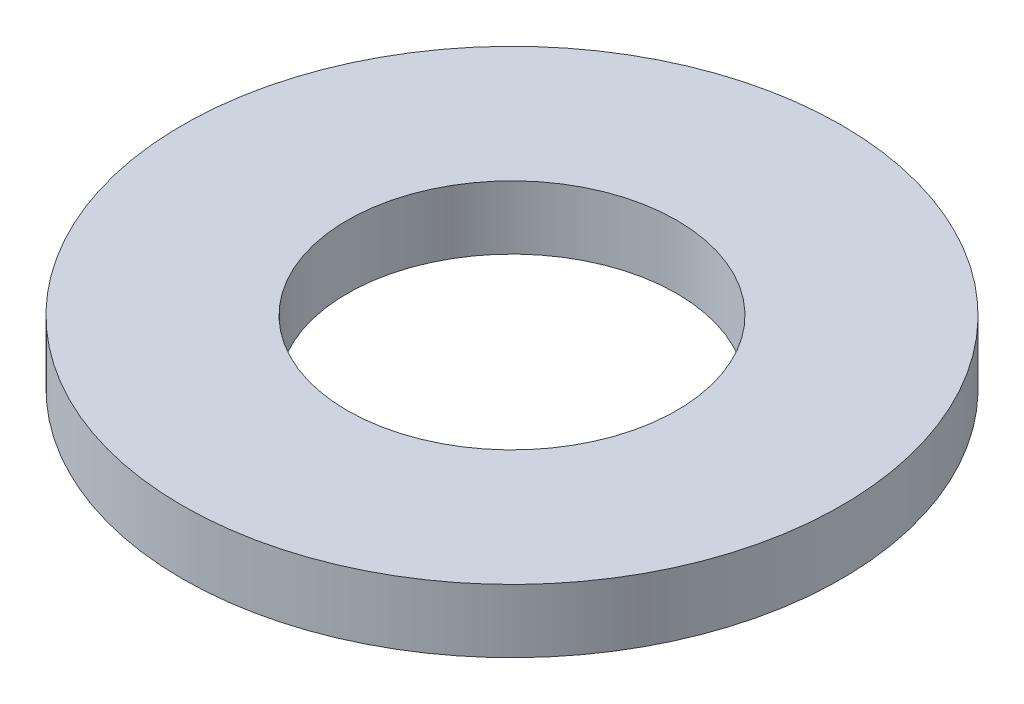
ISO-10303-21;
HEADER;
FILE_DESCRIPTION(('STEP AP214'),'2;1');
FILE_NAME('part.step','',(''),(''),'','','');
FILE_SCHEMA(('AUTOMOTIVE_DESIGN { 1 0 10303 214 1 1 1 1 }'));
ENDSEC;
DATA;
#1=APPLICATION_CONTEXT('core data for automotive mechanical design processes');
#2=APPLICATION_PROTOCOL_DEFINITION('international standard','automotive_design',2000,#1);
#3=PRODUCT_CONTEXT('',#1,'mechanical');
#4=PRODUCT('Part','Part','',(#3));
#5=PRODUCT_RELATED_PRODUCT_CATEGORY('part','',(#4));
#6=PRODUCT_DEFINITION_FORMATION('','',#4);
#7=PRODUCT_DEFINITION_CONTEXT('part definition',#1,'design');
#8=PRODUCT_DEFINITION('design','',#6,#7);
#9=PRODUCT_DEFINITION_SHAPE('','',#8);
#10=(LENGTH_UNIT() NAMED_UNIT(*) SI_UNIT(.MILLI.,.METRE.));
#11=(NAMED_UNIT(*) PLANE_ANGLE_UNIT() SI_UNIT($,.RADIAN.));
#12=(NAMED_UNIT(*) SI_UNIT($,.STERADIAN.) SOLID_ANGLE_UNIT());
#13=UNCERTAINTY_MEASURE_WITH_UNIT(LENGTH_MEASURE(1.E-05),#10,'distance_accuracy_value','');
#14=(GEOMETRIC_REPRESENTATION_CONTEXT(3) GLOBAL_UNCERTAINTY_ASSIGNED_CONTEXT((#13)) GLOBAL_UNIT_ASSIGNED_CONTEXT((#10,
#11,#12)) REPRESENTATION_CONTEXT('',''));
#15=CARTESIAN_POINT('',(0.,0.,0.));
#16=DIRECTION('',(0.,0.,1.));
#17=DIRECTION('',(1.,0.,0.));
#18=AXIS2_PLACEMENT_3D('',#15,#16,#17);
#19=CARTESIAN_POINT('',(5.58481322395702,0.77,0.));
#20=DIRECTION('',(0.,1.,0.));
#21=DIRECTION('',(0.,0.,1.));
#22=AXIS2_PLACEMENT_3D('',#19,#20,#21);
#23=PLANE('',#22);
#24=CARTESIAN_POINT('',(5.58481322395702,0.77,0.));
#25=DIRECTION('',(0.,1.,0.));
#26=DIRECTION('',(0.,0.,1.));
#27=AXIS2_PLACEMENT_3D('',#24,#25,#26);
#28=CIRCLE('',#27,4.);
#29=CARTESIAN_POINT('',(5.58481322395702,0.77,4.));
#30=VERTEX_POINT('',#29);
#31=EDGE_CURVE('E10',#30,#30,#28,.T.);
#32=ORIENTED_EDGE('',*,*,#31,.T.);
#33=EDGE_LOOP('',(#32));
#34=FACE_BOUND('',#33,.T.);
#35=CARTESIAN_POINT('',(5.58481322395702,0.77,0.));
#36=DIRECTION('',(0.,1.,0.));
#37=DIRECTION('',(0.,0.,1.));
#38=AXIS2_PLACEMENT_3D('',#35,#36,#37);
#39=CIRCLE('',#38,2.);
#40=CARTESIAN_POINT('',(5.58481322395702,0.77,2.));
#41=VERTEX_POINT('',#40);
#42=EDGE_CURVE('E50',#41,#41,#39,.T.);
#43=ORIENTED_EDGE('',*,*,#42,.F.);
#44=EDGE_LOOP('',(#43));
#45=FACE_BOUND('',#44,.T.);
#46=ADVANCED_FACE('F37',(#34,#45),#23,.T.);
#47=CARTESIAN_POINT('',(5.58481322395702,0.,0.));
#48=DIRECTION('',(0.,1.,0.));
#49=DIRECTION('',(0.,0.,1.));
#50=AXIS2_PLACEMENT_3D('',#47,#48,#49);
#51=PLANE('',#50);
#52=CARTESIAN_POINT('',(5.58481322395702,0.,0.));
#53=DIRECTION('',(0.,1.,0.));
#54=DIRECTION('',(0.,0.,1.));
#55=AXIS2_PLACEMENT_3D('',#52,#53,#54);
#56=CIRCLE('',#55,4.);
#57=CARTESIAN_POINT('',(5.58481322395702,0.,4.));
#58=VERTEX_POINT('',#57);
#59=EDGE_CURVE('E41',#58,#58,#56,.T.);
#60=ORIENTED_EDGE('',*,*,#59,.F.);
#61=EDGE_LOOP('',(#60));
#62=FACE_BOUND('',#61,.T.);
#63=CARTESIAN_POINT('',(5.58481322395702,0.,0.));
#64=DIRECTION('',(0.,1.,0.));
#65=DIRECTION('',(0.,0.,1.));
#66=AXIS2_PLACEMENT_3D('',#63,#64,#65);
#67=CIRCLE('',#66,2.);
#68=CARTESIAN_POINT('',(5.58481322395702,0.,2.));
#69=VERTEX_POINT('',#68);
#70=EDGE_CURVE('E52',#69,#69,#67,.T.);
#71=ORIENTED_EDGE('',*,*,#70,.T.);
#72=EDGE_LOOP('',(#71));
#73=FACE_BOUND('',#72,.T.);
#74=ADVANCED_FACE('F64',(#62,#73),#51,.F.);
#75=CARTESIAN_POINT('',(5.58481322395702,0.77,0.));
#76=DIRECTION('',(0.,-1.,0.));
#77=DIRECTION('',(0.,0.,-1.));
#78=AXIS2_PLACEMENT_3D('',#75,#76,#77);
#79=CYLINDRICAL_SURFACE('',#78,4.);
#80=ORIENTED_EDGE('',*,*,#31,.F.);
#81=EDGE_LOOP('',(#80));
#82=FACE_BOUND('',#81,.T.);
#83=ORIENTED_EDGE('',*,*,#59,.T.);
#84=EDGE_LOOP('',(#83));
#85=FACE_BOUND('',#84,.T.);
#86=ADVANCED_FACE('F39',(#82,#85),#79,.T.);
#87=CARTESIAN_POINT('',(5.58481322395702,0.77,0.));
#88=DIRECTION('',(0.,-1.,0.));
#89=DIRECTION('',(0.,0.,-1.));
#90=AXIS2_PLACEMENT_3D('',#87,#88,#89);
#91=CYLINDRICAL_SURFACE('',#90,2.);
#92=ORIENTED_EDGE('',*,*,#42,.T.);
#93=EDGE_LOOP('',(#92));
#94=FACE_BOUND('',#93,.T.);
#95=ORIENTED_EDGE('',*,*,#70,.F.);
#96=EDGE_LOOP('',(#95));
#97=FACE_BOUND('',#96,.T.);
#98=ADVANCED_FACE('F60',(#94,#97),#91,.F.);
#99=CLOSED_SHELL('',(#46,#74,#86,#98));
#100=MANIFOLD_SOLID_BREP('B2',#99);
#101=ADVANCED_BREP_SHAPE_REPRESENTATION('',(#18,#100),#14);
#102=SHAPE_DEFINITION_REPRESENTATION(#9,#101);
ENDSEC;
END-ISO-10303-21;
